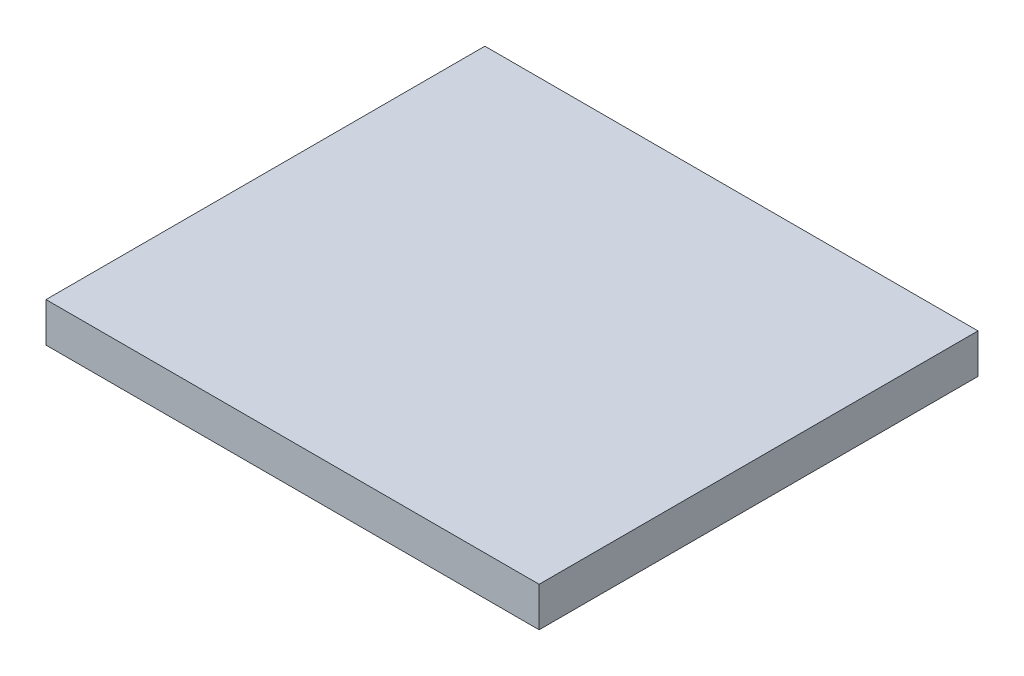
ISO-10303-21;
HEADER;
FILE_DESCRIPTION(('STEP AP214'),'2;1');
FILE_NAME('part.step','',(''),(''),'','','');
FILE_SCHEMA(('AUTOMOTIVE_DESIGN { 1 0 10303 214 1 1 1 1 }'));
ENDSEC;
DATA;
#1=APPLICATION_CONTEXT('core data for automotive mechanical design processes');
#2=APPLICATION_PROTOCOL_DEFINITION('international standard','automotive_design',2000,#1);
#3=PRODUCT_CONTEXT('',#1,'mechanical');
#4=PRODUCT('Part','Part','',(#3));
#5=PRODUCT_RELATED_PRODUCT_CATEGORY('part','',(#4));
#6=PRODUCT_DEFINITION_FORMATION('','',#4);
#7=PRODUCT_DEFINITION_CONTEXT('part definition',#1,'design');
#8=PRODUCT_DEFINITION('design','',#6,#7);
#9=PRODUCT_DEFINITION_SHAPE('','',#8);
#10=(LENGTH_UNIT() NAMED_UNIT(*) SI_UNIT(.MILLI.,.METRE.));
#11=(NAMED_UNIT(*) PLANE_ANGLE_UNIT() SI_UNIT($,.RADIAN.));
#12=(NAMED_UNIT(*) SI_UNIT($,.STERADIAN.) SOLID_ANGLE_UNIT());
#13=UNCERTAINTY_MEASURE_WITH_UNIT(LENGTH_MEASURE(1.E-05),#10,'distance_accuracy_value','');
#14=(GEOMETRIC_REPRESENTATION_CONTEXT(3) GLOBAL_UNCERTAINTY_ASSIGNED_CONTEXT((#13)) GLOBAL_UNIT_ASSIGNED_CONTEXT((#10,
#11,#12)) REPRESENTATION_CONTEXT('',''));
#15=CARTESIAN_POINT('',(0.,0.,0.));
#16=DIRECTION('',(0.,0.,1.));
#17=DIRECTION('',(1.,0.,0.));
#18=AXIS2_PLACEMENT_3D('',#15,#16,#17);
#19=CARTESIAN_POINT('',(50.,4.,0.));
#20=DIRECTION('',(0.,0.,1.));
#21=DIRECTION('',(1.,0.,0.));
#22=AXIS2_PLACEMENT_3D('',#19,#20,#21);
#23=PLANE('',#22);
#24=DIRECTION('',(-1.,0.,0.));
#25=VECTOR('',#24,1.);
#26=CARTESIAN_POINT('',(50.,0.,0.));
#27=LINE('',#26,#25);
#28=CARTESIAN_POINT('',(50.,0.,0.));
#29=VERTEX_POINT('',#28);
#30=CARTESIAN_POINT('',(0.,0.,0.));
#31=VERTEX_POINT('',#30);
#32=EDGE_CURVE('E102',#29,#31,#27,.T.);
#33=ORIENTED_EDGE('',*,*,#32,.T.);
#34=DIRECTION('',(0.,-1.,0.));
#35=VECTOR('',#34,1.);
#36=CARTESIAN_POINT('',(0.,4.,0.));
#37=LINE('',#36,#35);
#38=CARTESIAN_POINT('',(0.,4.,0.));
#39=VERTEX_POINT('',#38);
#40=EDGE_CURVE('E11',#39,#31,#37,.T.);
#41=ORIENTED_EDGE('',*,*,#40,.F.);
#42=DIRECTION('',(-1.,0.,0.));
#43=VECTOR('',#42,1.);
#44=CARTESIAN_POINT('',(50.,4.,0.));
#45=LINE('',#44,#43);
#46=CARTESIAN_POINT('',(50.,4.,0.));
#47=VERTEX_POINT('',#46);
#48=EDGE_CURVE('E90',#47,#39,#45,.T.);
#49=ORIENTED_EDGE('',*,*,#48,.F.);
#50=DIRECTION('',(0.,-1.,0.));
#51=VECTOR('',#50,1.);
#52=CARTESIAN_POINT('',(50.,4.,0.));
#53=LINE('',#52,#51);
#54=EDGE_CURVE('E98',#47,#29,#53,.T.);
#55=ORIENTED_EDGE('',*,*,#54,.T.);
#56=EDGE_LOOP('',(#33,#41,#49,#55));
#57=FACE_BOUND('',#56,.T.);
#58=ADVANCED_FACE('F39',(#57),#23,.F.);
#59=CARTESIAN_POINT('',(0.,4.,0.));
#60=DIRECTION('',(1.,0.,0.));
#61=DIRECTION('',(0.,0.,-1.));
#62=AXIS2_PLACEMENT_3D('',#59,#60,#61);
#63=PLANE('',#62);
#64=DIRECTION('',(0.,0.,1.));
#65=VECTOR('',#64,1.);
#66=CARTESIAN_POINT('',(0.,0.,0.));
#67=LINE('',#66,#65);
#68=CARTESIAN_POINT('',(0.,0.,44.5));
#69=VERTEX_POINT('',#68);
#70=EDGE_CURVE('E94',#31,#69,#67,.T.);
#71=ORIENTED_EDGE('',*,*,#70,.T.);
#72=DIRECTION('',(0.,-1.,0.));
#73=VECTOR('',#72,1.);
#74=CARTESIAN_POINT('',(0.,4.,44.5));
#75=LINE('',#74,#73);
#76=CARTESIAN_POINT('',(0.,4.,44.5));
#77=VERTEX_POINT('',#76);
#78=EDGE_CURVE('E47',#77,#69,#75,.T.);
#79=ORIENTED_EDGE('',*,*,#78,.F.);
#80=DIRECTION('',(0.,0.,1.));
#81=VECTOR('',#80,1.);
#82=CARTESIAN_POINT('',(0.,4.,0.));
#83=LINE('',#82,#81);
#84=EDGE_CURVE('E85',#39,#77,#83,.T.);
#85=ORIENTED_EDGE('',*,*,#84,.F.);
#86=ORIENTED_EDGE('',*,*,#40,.T.);
#87=EDGE_LOOP('',(#71,#79,#85,#86));
#88=FACE_BOUND('',#87,.T.);
#89=ADVANCED_FACE('F93',(#88),#63,.F.);
#90=CARTESIAN_POINT('',(0.,4.,44.5));
#91=DIRECTION('',(0.,0.,-1.));
#92=DIRECTION('',(-1.,0.,0.));
#93=AXIS2_PLACEMENT_3D('',#90,#91,#92);
#94=PLANE('',#93);
#95=DIRECTION('',(1.,0.,0.));
#96=VECTOR('',#95,1.);
#97=CARTESIAN_POINT('',(0.,0.,44.5));
#98=LINE('',#97,#96);
#99=CARTESIAN_POINT('',(50.,0.,44.5));
#100=VERTEX_POINT('',#99);
#101=EDGE_CURVE('E72',#69,#100,#98,.T.);
#102=ORIENTED_EDGE('',*,*,#101,.T.);
#103=DIRECTION('',(0.,-1.,0.));
#104=VECTOR('',#103,1.);
#105=CARTESIAN_POINT('',(50.,4.,44.5));
#106=LINE('',#105,#104);
#107=CARTESIAN_POINT('',(50.,4.,44.5));
#108=VERTEX_POINT('',#107);
#109=EDGE_CURVE('E95',#108,#100,#106,.T.);
#110=ORIENTED_EDGE('',*,*,#109,.F.);
#111=DIRECTION('',(1.,0.,0.));
#112=VECTOR('',#111,1.);
#113=CARTESIAN_POINT('',(0.,4.,44.5));
#114=LINE('',#113,#112);
#115=EDGE_CURVE('E88',#77,#108,#114,.T.);
#116=ORIENTED_EDGE('',*,*,#115,.F.);
#117=ORIENTED_EDGE('',*,*,#78,.T.);
#118=EDGE_LOOP('',(#102,#110,#116,#117));
#119=FACE_BOUND('',#118,.T.);
#120=ADVANCED_FACE('F96',(#119),#94,.F.);
#121=CARTESIAN_POINT('',(50.,4.,44.5));
#122=DIRECTION('',(-1.,0.,0.));
#123=DIRECTION('',(0.,0.,1.));
#124=AXIS2_PLACEMENT_3D('',#121,#122,#123);
#125=PLANE('',#124);
#126=DIRECTION('',(0.,0.,-1.));
#127=VECTOR('',#126,1.);
#128=CARTESIAN_POINT('',(50.,0.,44.5));
#129=LINE('',#128,#127);
#130=EDGE_CURVE('E78',#100,#29,#129,.T.);
#131=ORIENTED_EDGE('',*,*,#130,.T.);
#132=ORIENTED_EDGE('',*,*,#54,.F.);
#133=DIRECTION('',(0.,0.,-1.));
#134=VECTOR('',#133,1.);
#135=CARTESIAN_POINT('',(50.,4.,44.5));
#136=LINE('',#135,#134);
#137=EDGE_CURVE('E55',#108,#47,#136,.T.);
#138=ORIENTED_EDGE('',*,*,#137,.F.);
#139=ORIENTED_EDGE('',*,*,#109,.T.);
#140=EDGE_LOOP('',(#131,#132,#138,#139));
#141=FACE_BOUND('',#140,.T.);
#142=ADVANCED_FACE('F109',(#141),#125,.F.);
#143=CARTESIAN_POINT('',(0.,4.,0.));
#144=DIRECTION('',(0.,1.,0.));
#145=DIRECTION('',(0.,0.,1.));
#146=AXIS2_PLACEMENT_3D('',#143,#144,#145);
#147=PLANE('',#146);
#148=ORIENTED_EDGE('',*,*,#48,.T.);
#149=ORIENTED_EDGE('',*,*,#84,.T.);
#150=ORIENTED_EDGE('',*,*,#115,.T.);
#151=ORIENTED_EDGE('',*,*,#137,.T.);
#152=EDGE_LOOP('',(#148,#149,#150,#151));
#153=FACE_BOUND('',#152,.T.);
#154=ADVANCED_FACE('F86',(#153),#147,.T.);
#155=CARTESIAN_POINT('',(0.,0.,0.));
#156=DIRECTION('',(0.,1.,0.));
#157=DIRECTION('',(0.,0.,1.));
#158=AXIS2_PLACEMENT_3D('',#155,#156,#157);
#159=PLANE('',#158);
#160=ORIENTED_EDGE('',*,*,#32,.F.);
#161=ORIENTED_EDGE('',*,*,#130,.F.);
#162=ORIENTED_EDGE('',*,*,#101,.F.);
#163=ORIENTED_EDGE('',*,*,#70,.F.);
#164=EDGE_LOOP('',(#160,#161,#162,#163));
#165=FACE_BOUND('',#164,.T.);
#166=ADVANCED_FACE('F112',(#165),#159,.F.);
#167=CLOSED_SHELL('',(#58,#89,#120,#142,#154,#166));
#168=MANIFOLD_SOLID_BREP('B2',#167);
#169=ADVANCED_BREP_SHAPE_REPRESENTATION('',(#18,#168),#14);
#170=SHAPE_DEFINITION_REPRESENTATION(#9,#169);
ENDSEC;
END-ISO-10303-21;
